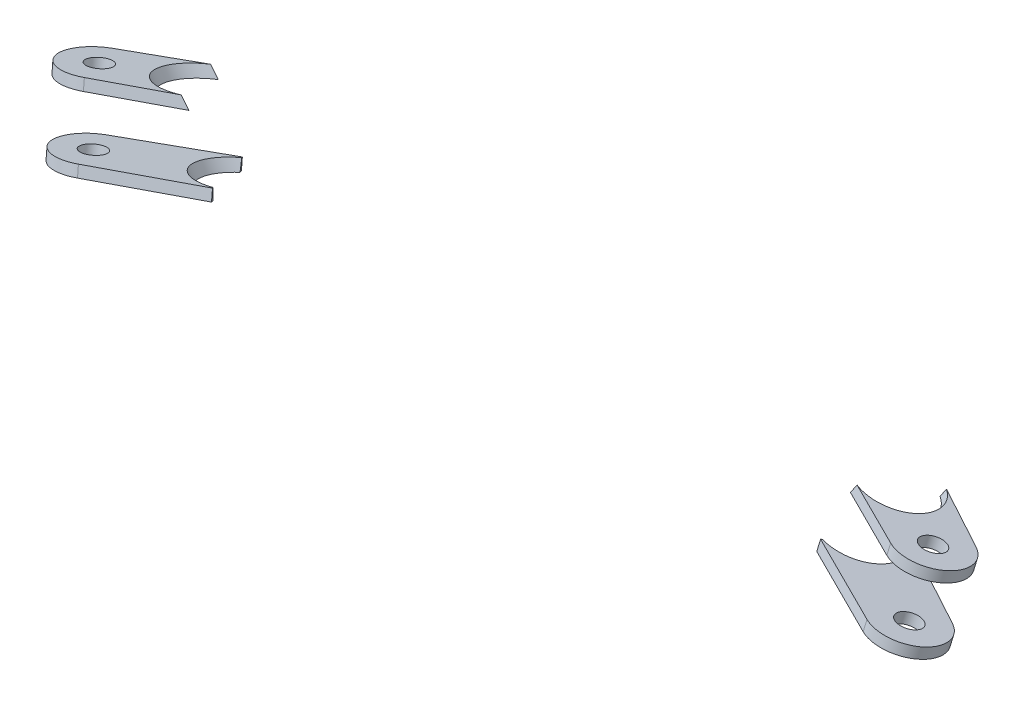
ISO-10303-21;
HEADER;
FILE_DESCRIPTION(('STEP AP214'),'2;1');
FILE_NAME('part.step','',(''),(''),'','','');
FILE_SCHEMA(('AUTOMOTIVE_DESIGN { 1 0 10303 214 1 1 1 1 }'));
ENDSEC;
DATA;
#1=APPLICATION_CONTEXT('core data for automotive mechanical design processes');
#2=APPLICATION_PROTOCOL_DEFINITION('international standard','automotive_design',2000,#1);
#3=PRODUCT_CONTEXT('',#1,'mechanical');
#4=PRODUCT('Part','Part','',(#3));
#5=PRODUCT_RELATED_PRODUCT_CATEGORY('part','',(#4));
#6=PRODUCT_DEFINITION_FORMATION('','',#4);
#7=PRODUCT_DEFINITION_CONTEXT('part definition',#1,'design');
#8=PRODUCT_DEFINITION('design','',#6,#7);
#9=PRODUCT_DEFINITION_SHAPE('','',#8);
#10=(LENGTH_UNIT() NAMED_UNIT(*) SI_UNIT(.MILLI.,.METRE.));
#11=(NAMED_UNIT(*) PLANE_ANGLE_UNIT() SI_UNIT($,.RADIAN.));
#12=(NAMED_UNIT(*) SI_UNIT($,.STERADIAN.) SOLID_ANGLE_UNIT());
#13=UNCERTAINTY_MEASURE_WITH_UNIT(LENGTH_MEASURE(1.E-05),#10,'distance_accuracy_value','');
#14=(GEOMETRIC_REPRESENTATION_CONTEXT(3) GLOBAL_UNCERTAINTY_ASSIGNED_CONTEXT((#13)) GLOBAL_UNIT_ASSIGNED_CONTEXT((#10,
#11,#12)) REPRESENTATION_CONTEXT('',''));
#15=CARTESIAN_POINT('',(0.,0.,0.));
#16=DIRECTION('',(0.,0.,1.));
#17=DIRECTION('',(1.,0.,0.));
#18=AXIS2_PLACEMENT_3D('',#15,#16,#17);
#19=CARTESIAN_POINT('',(-125.132028381921,152.673885786824,-744.648349422238));
#20=DIRECTION('',(0.453654215941863,0.26339489229841,0.851364189444965));
#21=DIRECTION('',(-0.882527927159571,0.,0.470259989562614));
#22=AXIS2_PLACEMENT_3D('',#19,#20,#21);
#23=PLANE('',#22);
#24=CARTESIAN_POINT('',(-816.236879343844,1295.64042753398,-729.999999999999));
#25=DIRECTION('',(-0.453654215941863,-0.26339489229841,-0.851364189444965));
#26=DIRECTION('',(-0.513355819149366,0.858138063925243,0.00805395481235083));
#27=AXIS2_PLACEMENT_3D('',#24,#25,#26);
#28=ELLIPSE('',#27,1342.546520207,12.7);
#29=CARTESIAN_POINT('',(-134.045192631762,152.542395292603,-739.85823901538));
#30=VERTEX_POINT('',#29);
#31=CARTESIAN_POINT('',(-131.479179662302,148.858828278426,-740.085932248414));
#32=VERTEX_POINT('',#31);
#33=EDGE_CURVE('E12',#30,#32,#28,.F.);
#34=ORIENTED_EDGE('',*,*,#33,.T.);
#35=DIRECTION('',(0.880779515732176,0.0129936048049018,-0.473348297663324));
#36=VECTOR('',#35,1.);
#37=CARTESIAN_POINT('',(-124.609430099155,148.960173517885,-743.777871267211));
#38=LINE('',#37,#36);
#39=CARTESIAN_POINT('',(-156.801248728356,148.485267185769,-726.477352494188));
#40=VERTEX_POINT('',#39);
#41=EDGE_CURVE('E50',#40,#32,#38,.T.);
#42=ORIENTED_EDGE('',*,*,#41,.F.);
#43=DIRECTION('',(0.135739813705361,-0.964600589334924,0.226098222084896));
#44=VECTOR('',#43,1.);
#45=CARTESIAN_POINT('',(-157.323847011121,152.198979454709,-727.347830649215));
#46=LINE('',#45,#44);
#47=CARTESIAN_POINT('',(-157.323847011121,152.198979454709,-727.347830649215));
#48=VERTEX_POINT('',#47);
#49=EDGE_CURVE('E98',#48,#40,#46,.T.);
#50=ORIENTED_EDGE('',*,*,#49,.F.);
#51=DIRECTION('',(0.880779515732176,0.0129936048049018,-0.473348297663324));
#52=VECTOR('',#51,1.);
#53=CARTESIAN_POINT('',(-125.132028381921,152.673885786824,-744.648349422238));
#54=LINE('',#53,#52);
#55=EDGE_CURVE('E89',#48,#30,#54,.T.);
#56=ORIENTED_EDGE('',*,*,#55,.T.);
#57=EDGE_LOOP('',(#34,#42,#50,#56));
#58=FACE_BOUND('',#57,.T.);
#59=ADVANCED_FACE('F46',(#58),#23,.F.);
#60=CARTESIAN_POINT('',(-151.879996419819,155.359718162289,-717.131460375875));
#61=DIRECTION('',(0.135739813705361,-0.964600589334924,0.226098222084896));
#62=DIRECTION('',(0.,-0.228210419162911,-0.973611834657677));
#63=AXIS2_PLACEMENT_3D('',#60,#61,#62);
#64=PLANE('',#63);
#65=CARTESIAN_POINT('',(-126.709862591882,155.885360954245,-730.));
#66=DIRECTION('',(-0.135739813705361,0.964600589334924,-0.226098222084896));
#67=DIRECTION('',(-0.890226251767514,-0.0185911213529017,0.455139089587793));
#68=AXIS2_PLACEMENT_3D('',#65,#66,#67);
#69=ELLIPSE('',#68,14.1807187851749,12.7);
#70=CARTESIAN_POINT('',(-123.123066836803,159.150043757302,-718.225276856768));
#71=VERTEX_POINT('',#70);
#72=EDGE_CURVE('E56',#71,#30,#69,.F.);
#73=ORIENTED_EDGE('',*,*,#72,.T.);
#74=ORIENTED_EDGE('',*,*,#55,.F.);
#75=CARTESIAN_POINT('',(-151.879996419819,155.359718162289,-717.131460375875));
#76=DIRECTION('',(0.135739813705361,-0.964600589334924,0.226098222084896));
#77=DIRECTION('',(0.,-0.228210419162911,-0.973611834657677));
#78=AXIS2_PLACEMENT_3D('',#75,#76,#77);
#79=CIRCLE('',#78,12.);
#80=CARTESIAN_POINT('',(-146.890429920738,158.51096978648,-706.682831788722));
#81=VERTEX_POINT('',#80);
#82=EDGE_CURVE('E100',#81,#48,#79,.T.);
#83=ORIENTED_EDGE('',*,*,#82,.F.);
#84=DIRECTION('',(-0.899270473540139,-0.0241802319566752,0.436724091162161));
#85=VECTOR('',#84,1.);
#86=CARTESIAN_POINT('',(-114.02278090561,159.394738797518,-722.644763784844));
#87=LINE('',#86,#85);
#88=EDGE_CURVE('E92',#71,#81,#87,.T.);
#89=ORIENTED_EDGE('',*,*,#88,.F.);
#90=EDGE_LOOP('',(#73,#74,#83,#89));
#91=FACE_BOUND('',#90,.T.);
#92=CARTESIAN_POINT('',(-151.879996419819,155.359718162289,-717.131460375875));
#93=DIRECTION('',(0.135739813705361,-0.964600589334924,0.226098222084896));
#94=DIRECTION('',(0.,0.228210419162911,0.973611834657677));
#95=AXIS2_PLACEMENT_3D('',#92,#93,#94);
#96=CIRCLE('',#95,4.19999999999998);
#97=CARTESIAN_POINT('',(-151.879996419819,156.318201922774,-713.042290670313));
#98=VERTEX_POINT('',#97);
#99=EDGE_CURVE('E122',#98,#98,#96,.T.);
#100=ORIENTED_EDGE('',*,*,#99,.T.);
#101=EDGE_LOOP('',(#100));
#102=FACE_BOUND('',#101,.T.);
#103=ADVANCED_FACE('F86',(#91,#102),#64,.F.);
#104=CARTESIAN_POINT('',(-151.357398137054,151.64600589335,-716.260982220849));
#105=DIRECTION('',(0.135739813705361,-0.964600589334924,0.226098222084896));
#106=DIRECTION('',(0.,-0.228210419162911,-0.973611834657677));
#107=AXIS2_PLACEMENT_3D('',#104,#105,#106);
#108=PLANE('',#107);
#109=DIRECTION('',(-0.899270473540139,-0.0241802319566752,0.436724091162161));
#110=VECTOR('',#109,1.);
#111=CARTESIAN_POINT('',(-113.500182622844,155.681026528579,-721.774285629817));
#112=LINE('',#111,#110);
#113=CARTESIAN_POINT('',(-120.51415471485,155.492429796992,-718.36800167249));
#114=VERTEX_POINT('',#113);
#115=CARTESIAN_POINT('',(-146.367831637972,154.79725751754,-705.812353633695));
#116=VERTEX_POINT('',#115);
#117=EDGE_CURVE('E118',#114,#116,#112,.T.);
#118=ORIENTED_EDGE('',*,*,#117,.T.);
#119=CARTESIAN_POINT('',(-151.357398137054,151.64600589335,-716.260982220849));
#120=DIRECTION('',(0.135739813705361,-0.964600589334924,0.226098222084896));
#121=DIRECTION('',(0.,-0.228210419162911,-0.973611834657677));
#122=AXIS2_PLACEMENT_3D('',#119,#120,#121);
#123=CIRCLE('',#122,12.);
#124=EDGE_CURVE('E110',#116,#40,#123,.T.);
#125=ORIENTED_EDGE('',*,*,#124,.T.);
#126=ORIENTED_EDGE('',*,*,#41,.T.);
#127=CARTESIAN_POINT('',(-124.484658396061,152.207205211619,-730.));
#128=DIRECTION('',(-0.135739813705361,0.964600589334924,-0.226098222084896));
#129=DIRECTION('',(-0.890226251767514,-0.0185911213529017,0.455139089587793));
#130=AXIS2_PLACEMENT_3D('',#127,#128,#129);
#131=ELLIPSE('',#130,14.1807187851749,12.7);
#132=EDGE_CURVE('E99',#114,#32,#131,.F.);
#133=ORIENTED_EDGE('',*,*,#132,.F.);
#134=EDGE_LOOP('',(#118,#125,#126,#133));
#135=FACE_BOUND('',#134,.T.);
#136=CARTESIAN_POINT('',(-151.357398137054,151.64600589335,-716.260982220849));
#137=DIRECTION('',(0.135739813705361,-0.964600589334924,0.226098222084896));
#138=DIRECTION('',(0.,0.228210419162911,0.973611834657677));
#139=AXIS2_PLACEMENT_3D('',#136,#137,#138);
#140=CIRCLE('',#139,4.19999999999998);
#141=CARTESIAN_POINT('',(-151.357398137054,152.604489653834,-712.171812515286));
#142=VERTEX_POINT('',#141);
#143=EDGE_CURVE('E106',#142,#142,#140,.T.);
#144=ORIENTED_EDGE('',*,*,#143,.F.);
#145=EDGE_LOOP('',(#144));
#146=FACE_BOUND('',#145,.T.);
#147=ADVANCED_FACE('F107',(#135,#146),#108,.T.);
#148=CARTESIAN_POINT('',(-114.02278090561,159.394738797518,-722.644763784844));
#149=DIRECTION('',(-0.415797208256775,-0.262604302015862,-0.870719048929466));
#150=DIRECTION('',(0.902389666748434,0.,-0.430920978075622));
#151=AXIS2_PLACEMENT_3D('',#148,#149,#150);
#152=PLANE('',#151);
#153=CARTESIAN_POINT('',(-816.236879448093,1295.6404277063,-729.999999999999));
#154=DIRECTION('',(0.415797208256775,0.262604302015862,0.870719048929466));
#155=DIRECTION('',(-0.521580880255224,0.853162080915203,-0.00823705290899768));
#156=AXIS2_PLACEMENT_3D('',#153,#154,#155);
#157=ELLIPSE('',#156,1342.54652040715,12.7);
#158=EDGE_CURVE('E63',#114,#71,#157,.F.);
#159=ORIENTED_EDGE('',*,*,#158,.T.);
#160=ORIENTED_EDGE('',*,*,#88,.T.);
#161=DIRECTION('',(0.135739813705361,-0.964600589334924,0.226098222084896));
#162=VECTOR('',#161,1.);
#163=CARTESIAN_POINT('',(-146.890429920738,158.51096978648,-706.682831788722));
#164=LINE('',#163,#162);
#165=EDGE_CURVE('E116',#81,#116,#164,.T.);
#166=ORIENTED_EDGE('',*,*,#165,.T.);
#167=ORIENTED_EDGE('',*,*,#117,.F.);
#168=EDGE_LOOP('',(#159,#160,#166,#167));
#169=FACE_BOUND('',#168,.T.);
#170=ADVANCED_FACE('F127',(#169),#152,.F.);
#171=CARTESIAN_POINT('',(-151.879996419819,155.359718162289,-717.131460375875));
#172=DIRECTION('',(0.135739813705361,-0.964600589334924,0.226098222084896));
#173=DIRECTION('',(0.,-0.228210419162911,-0.973611834657677));
#174=AXIS2_PLACEMENT_3D('',#171,#172,#173);
#175=CYLINDRICAL_SURFACE('',#174,12.);
#176=ORIENTED_EDGE('',*,*,#124,.F.);
#177=ORIENTED_EDGE('',*,*,#165,.F.);
#178=ORIENTED_EDGE('',*,*,#82,.T.);
#179=ORIENTED_EDGE('',*,*,#49,.T.);
#180=EDGE_LOOP('',(#176,#177,#178,#179));
#181=FACE_BOUND('',#180,.T.);
#182=ADVANCED_FACE('F128',(#181),#175,.T.);
#183=CARTESIAN_POINT('',(-151.879996419819,155.359718162289,-717.131460375875));
#184=DIRECTION('',(0.135739813705361,-0.964600589334924,0.226098222084896));
#185=DIRECTION('',(0.,-0.228210419162911,-0.973611834657677));
#186=AXIS2_PLACEMENT_3D('',#183,#184,#185);
#187=CYLINDRICAL_SURFACE('',#186,4.19999999999998);
#188=ORIENTED_EDGE('',*,*,#99,.F.);
#189=EDGE_LOOP('',(#188));
#190=FACE_BOUND('',#189,.T.);
#191=ORIENTED_EDGE('',*,*,#143,.T.);
#192=EDGE_LOOP('',(#191));
#193=FACE_BOUND('',#192,.T.);
#194=ADVANCED_FACE('F130',(#190,#193),#187,.F.);
#195=CARTESIAN_POINT('',(-105.,120.,-730.));
#196=DIRECTION('',(-0.517624253172971,0.855608048423531,0.));
#197=DIRECTION('',(-0.855608048423532,-0.517624253172971,0.));
#198=AXIS2_PLACEMENT_3D('',#195,#196,#197);
#199=CYLINDRICAL_SURFACE('',#198,12.7);
#200=ORIENTED_EDGE('',*,*,#158,.F.);
#201=ORIENTED_EDGE('',*,*,#132,.T.);
#202=ORIENTED_EDGE('',*,*,#33,.F.);
#203=ORIENTED_EDGE('',*,*,#72,.F.);
#204=EDGE_LOOP('',(#200,#201,#202,#203));
#205=FACE_BOUND('',#204,.T.);
#206=ADVANCED_FACE('F48',(#205),#199,.F.);
#207=CLOSED_SHELL('',(#59,#103,#147,#170,#182,#194,#206));
#208=MANIFOLD_SOLID_BREP('B2',#207);
#209=CARTESIAN_POINT('',(-121.372035542283,125.954449462247,-738.385428670486));
#210=DIRECTION('',(0.890226251766824,0.0185911213524841,-0.45513908958916));
#211=DIRECTION('',(0.455217764798812,0.,0.890380136015833));
#212=AXIS2_PLACEMENT_3D('',#209,#210,#211);
#213=PLANE('',#212);
#214=DIRECTION('',(0.434824014562703,0.263059068008641,0.861236322444658));
#215=VECTOR('',#214,1.);
#216=CARTESIAN_POINT('',(-121.894633825048,129.668161731186,-739.255906825513));
#217=LINE('',#216,#215);
#218=CARTESIAN_POINT('',(-111.023621300444,136.244887779559,-717.724182416604));
#219=VERTEX_POINT('',#218);
#220=CARTESIAN_POINT('',(-110.785386348737,136.38901474188,-717.25232118812));
#221=VERTEX_POINT('',#220);
#222=EDGE_CURVE('E263',#219,#221,#217,.T.);
#223=ORIENTED_EDGE('',*,*,#222,.T.);
#224=DIRECTION('',(-0.135739813705361,0.964600589334924,-0.226098222084896));
#225=VECTOR('',#224,1.);
#226=CARTESIAN_POINT('',(-110.262788065972,132.675302472941,-716.381843033093));
#227=LINE('',#226,#225);
#228=CARTESIAN_POINT('',(-110.262788065972,132.675302472941,-716.381843033093));
#229=VERTEX_POINT('',#228);
#230=EDGE_CURVE('E289',#229,#221,#227,.T.);
#231=ORIENTED_EDGE('',*,*,#230,.F.);
#232=DIRECTION('',(0.434824014562703,0.263059068008641,0.861236322444658));
#233=VECTOR('',#232,1.);
#234=CARTESIAN_POINT('',(-121.372035542283,125.954449462247,-738.385428670486));
#235=LINE('',#234,#233);
#236=CARTESIAN_POINT('',(-110.769227952913,132.368917360345,-717.384925685295));
#237=VERTEX_POINT('',#236);
#238=EDGE_CURVE('E290',#237,#229,#235,.T.);
#239=ORIENTED_EDGE('',*,*,#238,.F.);
#240=CARTESIAN_POINT('',(-117.388166225761,140.477044232369,-730.));
#241=DIRECTION('',(-0.890226251766824,-0.0185911213524841,0.45513908958916));
#242=DIRECTION('',(-0.135739813705704,0.964600589334717,-0.226098222085575));
#243=AXIS2_PLACEMENT_3D('',#240,#241,#242);
#244=ELLIPSE('',#243,28.5459981864058,12.7);
#245=EDGE_CURVE('E272',#219,#237,#244,.F.);
#246=ORIENTED_EDGE('',*,*,#245,.F.);
#247=EDGE_LOOP('',(#223,#231,#239,#246));
#248=FACE_BOUND('',#247,.T.);
#249=ADVANCED_FACE('F203',(#248),#213,.T.);
#250=CARTESIAN_POINT('',(-121.372035542283,125.954449462247,-738.385428670486));
#251=VERTEX_POINT('',#250);
#252=CARTESIAN_POINT('',(-120.865595655335,126.260834574846,-737.382346018272));
#253=VERTEX_POINT('',#252);
#254=EDGE_CURVE('E270',#251,#253,#235,.T.);
#255=ORIENTED_EDGE('',*,*,#254,.F.);
#256=DIRECTION('',(-0.135739813705361,0.964600589334924,-0.226098222084896));
#257=VECTOR('',#256,1.);
#258=CARTESIAN_POINT('',(-121.372035542283,125.954449462247,-738.385428670486));
#259=LINE('',#258,#257);
#260=CARTESIAN_POINT('',(-121.894633825048,129.668161731186,-739.255906825513));
#261=VERTEX_POINT('',#260);
#262=EDGE_CURVE('E274',#251,#261,#259,.T.);
#263=ORIENTED_EDGE('',*,*,#262,.T.);
#264=CARTESIAN_POINT('',(-121.656398873337,129.812288693509,-738.784045597021));
#265=VERTEX_POINT('',#264);
#266=EDGE_CURVE('E207',#261,#265,#217,.T.);
#267=ORIENTED_EDGE('',*,*,#266,.T.);
#268=EDGE_CURVE('E265',#253,#265,#244,.F.);
#269=ORIENTED_EDGE('',*,*,#268,.F.);
#270=EDGE_LOOP('',(#255,#263,#267,#269));
#271=FACE_BOUND('',#270,.T.);
#272=ADVANCED_FACE('F205',(#271),#213,.T.);
#273=CARTESIAN_POINT('',(-121.372035542283,125.954449462247,-738.385428670486));
#274=DIRECTION('',(-0.453654215941863,-0.26339489229841,-0.851364189444965));
#275=DIRECTION('',(0.882527927159571,0.,-0.470259989562614));
#276=AXIS2_PLACEMENT_3D('',#273,#274,#275);
#277=PLANE('',#276);
#278=DIRECTION('',(0.880779515732176,0.0129936048049018,-0.473348297663324));
#279=VECTOR('',#278,1.);
#280=CARTESIAN_POINT('',(-121.894633825048,129.668161731186,-739.255906825513));
#281=LINE('',#280,#279);
#282=CARTESIAN_POINT('',(-154.086452454249,129.193255399071,-721.95538805249));
#283=VERTEX_POINT('',#282);
#284=EDGE_CURVE('E275',#283,#261,#281,.T.);
#285=ORIENTED_EDGE('',*,*,#284,.T.);
#286=ORIENTED_EDGE('',*,*,#262,.F.);
#287=DIRECTION('',(0.880779515732176,0.0129936048049018,-0.473348297663324));
#288=VECTOR('',#287,1.);
#289=CARTESIAN_POINT('',(-121.372035542283,125.954449462247,-738.385428670486));
#290=LINE('',#289,#288);
#291=CARTESIAN_POINT('',(-153.563854171483,125.479543130131,-721.084909897463));
#292=VERTEX_POINT('',#291);
#293=EDGE_CURVE('E269',#292,#251,#290,.T.);
#294=ORIENTED_EDGE('',*,*,#293,.F.);
#295=DIRECTION('',(-0.135739813705361,0.964600589334924,-0.226098222084896));
#296=VECTOR('',#295,1.);
#297=CARTESIAN_POINT('',(-153.563854171483,125.479543130131,-721.084909897463));
#298=LINE('',#297,#296);
#299=EDGE_CURVE('E300',#292,#283,#298,.T.);
#300=ORIENTED_EDGE('',*,*,#299,.T.);
#301=EDGE_LOOP('',(#285,#286,#294,#300));
#302=FACE_BOUND('',#301,.T.);
#303=ADVANCED_FACE('F316',(#302),#277,.T.);
#304=CARTESIAN_POINT('',(-148.120003580181,128.640281837712,-710.868539624124));
#305=DIRECTION('',(-0.135739813705361,0.964600589334924,-0.226098222084896));
#306=DIRECTION('',(0.,0.228210419162911,0.973611834657677));
#307=AXIS2_PLACEMENT_3D('',#304,#305,#306);
#308=CYLINDRICAL_SURFACE('',#307,12.);
#309=CARTESIAN_POINT('',(-148.642601862946,132.353994106652,-711.739017779151));
#310=DIRECTION('',(0.135739813705361,-0.964600589334924,0.226098222084896));
#311=DIRECTION('',(0.,-0.228210419162911,-0.973611834657677));
#312=AXIS2_PLACEMENT_3D('',#309,#310,#311);
#313=CIRCLE('',#312,12.);
#314=CARTESIAN_POINT('',(-143.653035363865,135.505245730842,-701.290389191997));
#315=VERTEX_POINT('',#314);
#316=EDGE_CURVE('E278',#315,#283,#313,.T.);
#317=ORIENTED_EDGE('',*,*,#316,.T.);
#318=ORIENTED_EDGE('',*,*,#299,.F.);
#319=CARTESIAN_POINT('',(-148.120003580181,128.640281837712,-710.868539624124));
#320=DIRECTION('',(0.135739813705361,-0.964600589334924,0.226098222084896));
#321=DIRECTION('',(0.,-0.228210419162911,-0.973611834657677));
#322=AXIS2_PLACEMENT_3D('',#319,#320,#321);
#323=CIRCLE('',#322,12.);
#324=CARTESIAN_POINT('',(-143.130437081099,131.791533461902,-700.41991103697));
#325=VERTEX_POINT('',#324);
#326=EDGE_CURVE('E304',#325,#292,#323,.T.);
#327=ORIENTED_EDGE('',*,*,#326,.F.);
#328=DIRECTION('',(-0.135739813705361,0.964600589334924,-0.226098222084896));
#329=VECTOR('',#328,1.);
#330=CARTESIAN_POINT('',(-143.130437081099,131.791533461902,-700.41991103697));
#331=LINE('',#330,#329);
#332=EDGE_CURVE('E287',#325,#315,#331,.T.);
#333=ORIENTED_EDGE('',*,*,#332,.T.);
#334=EDGE_LOOP('',(#317,#318,#327,#333));
#335=FACE_BOUND('',#334,.T.);
#336=ADVANCED_FACE('F313',(#335),#308,.T.);
#337=CARTESIAN_POINT('',(-110.262788065972,132.675302472941,-716.381843033093));
#338=DIRECTION('',(0.415797208256775,0.262604302015862,0.870719048929466));
#339=DIRECTION('',(-0.902389666748434,0.,0.430920978075622));
#340=AXIS2_PLACEMENT_3D('',#337,#338,#339);
#341=PLANE('',#340);
#342=DIRECTION('',(-0.899270473540139,-0.0241802319566752,0.436724091162161));
#343=VECTOR('',#342,1.);
#344=CARTESIAN_POINT('',(-110.785386348737,136.38901474188,-717.25232118812));
#345=LINE('',#344,#343);
#346=EDGE_CURVE('E280',#221,#315,#345,.T.);
#347=ORIENTED_EDGE('',*,*,#346,.T.);
#348=ORIENTED_EDGE('',*,*,#332,.F.);
#349=DIRECTION('',(-0.899270473540139,-0.0241802319566752,0.436724091162161));
#350=VECTOR('',#349,1.);
#351=CARTESIAN_POINT('',(-110.262788065972,132.675302472941,-716.381843033093));
#352=LINE('',#351,#350);
#353=EDGE_CURVE('E298',#229,#325,#352,.T.);
#354=ORIENTED_EDGE('',*,*,#353,.F.);
#355=ORIENTED_EDGE('',*,*,#230,.T.);
#356=EDGE_LOOP('',(#347,#348,#354,#355));
#357=FACE_BOUND('',#356,.T.);
#358=ADVANCED_FACE('F295',(#357),#341,.T.);
#359=CARTESIAN_POINT('',(-148.120003580181,128.640281837712,-710.868539624124));
#360=DIRECTION('',(0.135739813705361,-0.964600589334924,0.226098222084896));
#361=DIRECTION('',(0.,-0.228210419162911,-0.973611834657677));
#362=AXIS2_PLACEMENT_3D('',#359,#360,#361);
#363=PLANE('',#362);
#364=CARTESIAN_POINT('',(-148.120003580181,128.640281837712,-710.868539624124));
#365=DIRECTION('',(0.135739813705361,-0.964600589334924,0.226098222084896));
#366=DIRECTION('',(0.,0.228210419162911,0.973611834657677));
#367=AXIS2_PLACEMENT_3D('',#364,#365,#366);
#368=CIRCLE('',#367,4.19999999999998);
#369=CARTESIAN_POINT('',(-148.120003580181,129.598765598196,-706.779369918562));
#370=VERTEX_POINT('',#369);
#371=EDGE_CURVE('E284',#370,#370,#368,.T.);
#372=ORIENTED_EDGE('',*,*,#371,.F.);
#373=EDGE_LOOP('',(#372));
#374=FACE_BOUND('',#373,.T.);
#375=ORIENTED_EDGE('',*,*,#238,.T.);
#376=ORIENTED_EDGE('',*,*,#353,.T.);
#377=ORIENTED_EDGE('',*,*,#326,.T.);
#378=ORIENTED_EDGE('',*,*,#293,.T.);
#379=ORIENTED_EDGE('',*,*,#254,.T.);
#380=CARTESIAN_POINT('',(-110.699951884283,129.421746909896,-730.));
#381=DIRECTION('',(-0.135739813705361,0.964600589334924,-0.226098222084896));
#382=DIRECTION('',(-0.890226251767514,-0.0185911213529017,0.455139089587793));
#383=AXIS2_PLACEMENT_3D('',#380,#381,#382);
#384=ELLIPSE('',#383,14.1807187851749,12.7);
#385=EDGE_CURVE('E222',#237,#253,#384,.F.);
#386=ORIENTED_EDGE('',*,*,#385,.F.);
#387=EDGE_LOOP('',(#375,#376,#377,#378,#379,#386));
#388=FACE_BOUND('',#387,.T.);
#389=ADVANCED_FACE('F317',(#374,#388),#363,.T.);
#390=CARTESIAN_POINT('',(-148.642601862946,132.353994106652,-711.739017779151));
#391=DIRECTION('',(0.135739813705361,-0.964600589334924,0.226098222084896));
#392=DIRECTION('',(0.,-0.228210419162911,-0.973611834657677));
#393=AXIS2_PLACEMENT_3D('',#390,#391,#392);
#394=PLANE('',#393);
#395=CARTESIAN_POINT('',(-112.925156080105,133.099902652522,-730.));
#396=DIRECTION('',(-0.135739813705361,0.964600589334924,-0.226098222084896));
#397=DIRECTION('',(-0.890226251767514,-0.0185911213529017,0.455139089587793));
#398=AXIS2_PLACEMENT_3D('',#395,#396,#397);
#399=ELLIPSE('',#398,14.1807187851749,12.7);
#400=EDGE_CURVE('E44',#219,#265,#399,.F.);
#401=ORIENTED_EDGE('',*,*,#400,.T.);
#402=ORIENTED_EDGE('',*,*,#266,.F.);
#403=ORIENTED_EDGE('',*,*,#284,.F.);
#404=ORIENTED_EDGE('',*,*,#316,.F.);
#405=ORIENTED_EDGE('',*,*,#346,.F.);
#406=ORIENTED_EDGE('',*,*,#222,.F.);
#407=EDGE_LOOP('',(#401,#402,#403,#404,#405,#406));
#408=FACE_BOUND('',#407,.T.);
#409=CARTESIAN_POINT('',(-148.642601862946,132.353994106652,-711.739017779151));
#410=DIRECTION('',(0.135739813705361,-0.964600589334924,0.226098222084896));
#411=DIRECTION('',(0.,0.228210419162911,0.973611834657677));
#412=AXIS2_PLACEMENT_3D('',#409,#410,#411);
#413=CIRCLE('',#412,4.19999999999998);
#414=CARTESIAN_POINT('',(-148.642601862946,133.312477867136,-707.649848073589));
#415=VERTEX_POINT('',#414);
#416=EDGE_CURVE('E213',#415,#415,#413,.T.);
#417=ORIENTED_EDGE('',*,*,#416,.T.);
#418=EDGE_LOOP('',(#417));
#419=FACE_BOUND('',#418,.T.);
#420=ADVANCED_FACE('F257',(#408,#419),#394,.F.);
#421=CARTESIAN_POINT('',(-148.120003580181,128.640281837712,-710.868539624124));
#422=DIRECTION('',(-0.135739813705361,0.964600589334924,-0.226098222084896));
#423=DIRECTION('',(0.,0.228210419162911,0.973611834657677));
#424=AXIS2_PLACEMENT_3D('',#421,#422,#423);
#425=CYLINDRICAL_SURFACE('',#424,4.19999999999998);
#426=ORIENTED_EDGE('',*,*,#371,.T.);
#427=EDGE_LOOP('',(#426));
#428=FACE_BOUND('',#427,.T.);
#429=ORIENTED_EDGE('',*,*,#416,.F.);
#430=EDGE_LOOP('',(#429));
#431=FACE_BOUND('',#430,.T.);
#432=ADVANCED_FACE('F325',(#428,#431),#425,.F.);
#433=CARTESIAN_POINT('',(-105.,120.,-730.));
#434=DIRECTION('',(-0.517624253172971,0.855608048423531,0.));
#435=DIRECTION('',(-0.855608048423532,-0.517624253172971,0.));
#436=AXIS2_PLACEMENT_3D('',#433,#434,#435);
#437=CYLINDRICAL_SURFACE('',#436,12.7);
#438=ORIENTED_EDGE('',*,*,#245,.T.);
#439=ORIENTED_EDGE('',*,*,#385,.T.);
#440=ORIENTED_EDGE('',*,*,#268,.T.);
#441=ORIENTED_EDGE('',*,*,#400,.F.);
#442=EDGE_LOOP('',(#438,#439,#440,#441));
#443=FACE_BOUND('',#442,.T.);
#444=ADVANCED_FACE('F266',(#443),#437,.F.);
#445=CLOSED_SHELL('',(#249,#272,#303,#336,#358,#389,#420,#432,#444));
#446=MANIFOLD_SOLID_BREP('B6',#445);
#447=CARTESIAN_POINT('',(121.372035542283,125.954449462247,-738.385428670486));
#448=DIRECTION('',(-0.890226251766824,0.0185911213524841,-0.45513908958916));
#449=DIRECTION('',(-0.455217764798812,0.,0.890380136015833));
#450=AXIS2_PLACEMENT_3D('',#447,#448,#449);
#451=PLANE('',#450);
#452=DIRECTION('',(-0.434824014562703,0.263059068008641,0.861236322444658));
#453=VECTOR('',#452,1.);
#454=CARTESIAN_POINT('',(121.894633825048,129.668161731186,-739.255906825513));
#455=LINE('',#454,#453);
#456=CARTESIAN_POINT('',(111.023621300444,136.244887779559,-717.724182416604));
#457=VERTEX_POINT('',#456);
#458=CARTESIAN_POINT('',(110.785386348737,136.38901474188,-717.25232118812));
#459=VERTEX_POINT('',#458);
#460=EDGE_CURVE('E475',#457,#459,#455,.T.);
#461=ORIENTED_EDGE('',*,*,#460,.F.);
#462=CARTESIAN_POINT('',(117.388166225761,140.477044232369,-730.));
#463=DIRECTION('',(-0.890226251766824,0.0185911213524841,-0.45513908958916));
#464=DIRECTION('',(0.135739813705704,0.964600589334717,-0.226098222085575));
#465=AXIS2_PLACEMENT_3D('',#462,#463,#464);
#466=ELLIPSE('',#465,28.5459981864058,12.7);
#467=CARTESIAN_POINT('',(110.769227952913,132.368917360345,-717.384925685295));
#468=VERTEX_POINT('',#467);
#469=EDGE_CURVE('E454',#457,#468,#466,.F.);
#470=ORIENTED_EDGE('',*,*,#469,.T.);
#471=DIRECTION('',(-0.434824014562703,0.263059068008641,0.861236322444658));
#472=VECTOR('',#471,1.);
#473=CARTESIAN_POINT('',(121.372035542283,125.954449462247,-738.385428670486));
#474=LINE('',#473,#472);
#475=CARTESIAN_POINT('',(110.262788065972,132.675302472941,-716.381843033093));
#476=VERTEX_POINT('',#475);
#477=EDGE_CURVE('E492',#468,#476,#474,.T.);
#478=ORIENTED_EDGE('',*,*,#477,.T.);
#479=DIRECTION('',(0.135739813705361,0.964600589334924,-0.226098222084896));
#480=VECTOR('',#479,1.);
#481=CARTESIAN_POINT('',(110.262788065972,132.675302472941,-716.381843033093));
#482=LINE('',#481,#480);
#483=EDGE_CURVE('E491',#476,#459,#482,.T.);
#484=ORIENTED_EDGE('',*,*,#483,.T.);
#485=EDGE_LOOP('',(#461,#470,#478,#484));
#486=FACE_BOUND('',#485,.T.);
#487=ADVANCED_FACE('F407',(#486),#451,.T.);
#488=CARTESIAN_POINT('',(121.372035542283,125.954449462247,-738.385428670486));
#489=VERTEX_POINT('',#488);
#490=CARTESIAN_POINT('',(120.865595655335,126.260834574846,-737.382346018272));
#491=VERTEX_POINT('',#490);
#492=EDGE_CURVE('E467',#489,#491,#474,.T.);
#493=ORIENTED_EDGE('',*,*,#492,.T.);
#494=CARTESIAN_POINT('',(121.656398873337,129.812288693509,-738.784045597021));
#495=VERTEX_POINT('',#494);
#496=EDGE_CURVE('E458',#491,#495,#466,.F.);
#497=ORIENTED_EDGE('',*,*,#496,.T.);
#498=CARTESIAN_POINT('',(121.894633825048,129.668161731186,-739.255906825513));
#499=VERTEX_POINT('',#498);
#500=EDGE_CURVE('E411',#499,#495,#455,.T.);
#501=ORIENTED_EDGE('',*,*,#500,.F.);
#502=DIRECTION('',(0.135739813705361,0.964600589334924,-0.226098222084896));
#503=VECTOR('',#502,1.);
#504=CARTESIAN_POINT('',(121.372035542283,125.954449462247,-738.385428670486));
#505=LINE('',#504,#503);
#506=EDGE_CURVE('E511',#489,#499,#505,.T.);
#507=ORIENTED_EDGE('',*,*,#506,.F.);
#508=EDGE_LOOP('',(#493,#497,#501,#507));
#509=FACE_BOUND('',#508,.T.);
#510=ADVANCED_FACE('F409',(#509),#451,.T.);
#511=CARTESIAN_POINT('',(121.372035542283,125.954449462247,-738.385428670486));
#512=DIRECTION('',(0.453654215941863,-0.26339489229841,-0.851364189444965));
#513=DIRECTION('',(-0.882527927159571,0.,-0.470259989562614));
#514=AXIS2_PLACEMENT_3D('',#511,#512,#513);
#515=PLANE('',#514);
#516=DIRECTION('',(-0.880779515732176,0.0129936048049018,-0.473348297663324));
#517=VECTOR('',#516,1.);
#518=CARTESIAN_POINT('',(121.894633825048,129.668161731186,-739.255906825513));
#519=LINE('',#518,#517);
#520=CARTESIAN_POINT('',(154.086452454249,129.193255399071,-721.95538805249));
#521=VERTEX_POINT('',#520);
#522=EDGE_CURVE('E474',#521,#499,#519,.T.);
#523=ORIENTED_EDGE('',*,*,#522,.F.);
#524=DIRECTION('',(0.135739813705361,0.964600589334924,-0.226098222084896));
#525=VECTOR('',#524,1.);
#526=CARTESIAN_POINT('',(153.563854171483,125.479543130131,-721.084909897463));
#527=LINE('',#526,#525);
#528=CARTESIAN_POINT('',(153.563854171483,125.479543130131,-721.084909897463));
#529=VERTEX_POINT('',#528);
#530=EDGE_CURVE('E505',#529,#521,#527,.T.);
#531=ORIENTED_EDGE('',*,*,#530,.F.);
#532=DIRECTION('',(-0.880779515732176,0.0129936048049018,-0.473348297663324));
#533=VECTOR('',#532,1.);
#534=CARTESIAN_POINT('',(121.372035542283,125.954449462247,-738.385428670486));
#535=LINE('',#534,#533);
#536=EDGE_CURVE('E468',#529,#489,#535,.T.);
#537=ORIENTED_EDGE('',*,*,#536,.T.);
#538=ORIENTED_EDGE('',*,*,#506,.T.);
#539=EDGE_LOOP('',(#523,#531,#537,#538));
#540=FACE_BOUND('',#539,.T.);
#541=ADVANCED_FACE('F516',(#540),#515,.T.);
#542=CARTESIAN_POINT('',(148.120003580181,128.640281837712,-710.868539624124));
#543=DIRECTION('',(0.135739813705361,0.964600589334924,-0.226098222084896));
#544=DIRECTION('',(0.,0.228210419162911,0.973611834657677));
#545=AXIS2_PLACEMENT_3D('',#542,#543,#544);
#546=CYLINDRICAL_SURFACE('',#545,12.);
#547=CARTESIAN_POINT('',(148.642601862946,132.353994106652,-711.739017779151));
#548=DIRECTION('',(0.135739813705361,0.964600589334924,-0.226098222084896));
#549=DIRECTION('',(0.,-0.228210419162911,-0.973611834657677));
#550=AXIS2_PLACEMENT_3D('',#547,#548,#549);
#551=CIRCLE('',#550,12.);
#552=CARTESIAN_POINT('',(143.653035363865,135.505245730842,-701.290389191997));
#553=VERTEX_POINT('',#552);
#554=EDGE_CURVE('E478',#553,#521,#551,.T.);
#555=ORIENTED_EDGE('',*,*,#554,.F.);
#556=DIRECTION('',(0.135739813705361,0.964600589334924,-0.226098222084896));
#557=VECTOR('',#556,1.);
#558=CARTESIAN_POINT('',(143.130437081099,131.791533461902,-700.41991103697));
#559=LINE('',#558,#557);
#560=CARTESIAN_POINT('',(143.130437081099,131.791533461902,-700.41991103697));
#561=VERTEX_POINT('',#560);
#562=EDGE_CURVE('E489',#561,#553,#559,.T.);
#563=ORIENTED_EDGE('',*,*,#562,.F.);
#564=CARTESIAN_POINT('',(148.120003580181,128.640281837712,-710.868539624124));
#565=DIRECTION('',(0.135739813705361,0.964600589334924,-0.226098222084896));
#566=DIRECTION('',(0.,-0.228210419162911,-0.973611834657677));
#567=AXIS2_PLACEMENT_3D('',#564,#565,#566);
#568=CIRCLE('',#567,12.);
#569=EDGE_CURVE('E503',#561,#529,#568,.T.);
#570=ORIENTED_EDGE('',*,*,#569,.T.);
#571=ORIENTED_EDGE('',*,*,#530,.T.);
#572=EDGE_LOOP('',(#555,#563,#570,#571));
#573=FACE_BOUND('',#572,.T.);
#574=ADVANCED_FACE('F519',(#573),#546,.T.);
#575=CARTESIAN_POINT('',(110.262788065972,132.675302472941,-716.381843033093));
#576=DIRECTION('',(-0.415797208256775,0.262604302015862,0.870719048929466));
#577=DIRECTION('',(0.902389666748434,0.,0.430920978075622));
#578=AXIS2_PLACEMENT_3D('',#575,#576,#577);
#579=PLANE('',#578);
#580=DIRECTION('',(0.899270473540139,-0.0241802319566752,0.436724091162161));
#581=VECTOR('',#580,1.);
#582=CARTESIAN_POINT('',(110.785386348737,136.38901474188,-717.25232118812));
#583=LINE('',#582,#581);
#584=EDGE_CURVE('E480',#459,#553,#583,.T.);
#585=ORIENTED_EDGE('',*,*,#584,.F.);
#586=ORIENTED_EDGE('',*,*,#483,.F.);
#587=DIRECTION('',(0.899270473540139,-0.0241802319566752,0.436724091162161));
#588=VECTOR('',#587,1.);
#589=CARTESIAN_POINT('',(110.262788065972,132.675302472941,-716.381843033093));
#590=LINE('',#589,#588);
#591=EDGE_CURVE('E500',#476,#561,#590,.T.);
#592=ORIENTED_EDGE('',*,*,#591,.T.);
#593=ORIENTED_EDGE('',*,*,#562,.T.);
#594=EDGE_LOOP('',(#585,#586,#592,#593));
#595=FACE_BOUND('',#594,.T.);
#596=ADVANCED_FACE('F521',(#595),#579,.T.);
#597=CARTESIAN_POINT('',(148.120003580181,128.640281837712,-710.868539624124));
#598=DIRECTION('',(-0.135739813705361,-0.964600589334924,0.226098222084896));
#599=DIRECTION('',(0.,-0.228210419162911,-0.973611834657677));
#600=AXIS2_PLACEMENT_3D('',#597,#598,#599);
#601=PLANE('',#600);
#602=CARTESIAN_POINT('',(148.120003580181,128.640281837712,-710.868539624124));
#603=DIRECTION('',(0.135739813705361,0.964600589334924,-0.226098222084896));
#604=DIRECTION('',(0.,0.228210419162911,0.973611834657677));
#605=AXIS2_PLACEMENT_3D('',#602,#603,#604);
#606=CIRCLE('',#605,4.19999999999998);
#607=CARTESIAN_POINT('',(148.120003580181,129.598765598196,-706.779369918562));
#608=VERTEX_POINT('',#607);
#609=EDGE_CURVE('E484',#608,#608,#606,.T.);
#610=ORIENTED_EDGE('',*,*,#609,.T.);
#611=EDGE_LOOP('',(#610));
#612=FACE_BOUND('',#611,.T.);
#613=ORIENTED_EDGE('',*,*,#477,.F.);
#614=CARTESIAN_POINT('',(110.699951884283,129.421746909896,-730.));
#615=DIRECTION('',(-0.135739813705361,-0.964600589334924,0.226098222084896));
#616=DIRECTION('',(0.890226251767514,-0.0185911213529017,0.455139089587793));
#617=AXIS2_PLACEMENT_3D('',#614,#615,#616);
#618=ELLIPSE('',#617,14.1807187851749,12.7);
#619=EDGE_CURVE('E426',#468,#491,#618,.F.);
#620=ORIENTED_EDGE('',*,*,#619,.T.);
#621=ORIENTED_EDGE('',*,*,#492,.F.);
#622=ORIENTED_EDGE('',*,*,#536,.F.);
#623=ORIENTED_EDGE('',*,*,#569,.F.);
#624=ORIENTED_EDGE('',*,*,#591,.F.);
#625=EDGE_LOOP('',(#613,#620,#621,#622,#623,#624));
#626=FACE_BOUND('',#625,.T.);
#627=ADVANCED_FACE('F497',(#612,#626),#601,.T.);
#628=CARTESIAN_POINT('',(148.642601862946,132.353994106652,-711.739017779151));
#629=DIRECTION('',(-0.135739813705361,-0.964600589334924,0.226098222084896));
#630=DIRECTION('',(0.,-0.228210419162911,-0.973611834657677));
#631=AXIS2_PLACEMENT_3D('',#628,#629,#630);
#632=PLANE('',#631);
#633=CARTESIAN_POINT('',(112.925156080105,133.099902652522,-730.));
#634=DIRECTION('',(-0.135739813705361,-0.964600589334924,0.226098222084896));
#635=DIRECTION('',(0.890226251767514,-0.0185911213529017,0.455139089587793));
#636=AXIS2_PLACEMENT_3D('',#633,#634,#635);
#637=ELLIPSE('',#636,14.1807187851749,12.7);
#638=EDGE_CURVE('E201',#457,#495,#637,.F.);
#639=ORIENTED_EDGE('',*,*,#638,.F.);
#640=ORIENTED_EDGE('',*,*,#460,.T.);
#641=ORIENTED_EDGE('',*,*,#584,.T.);
#642=ORIENTED_EDGE('',*,*,#554,.T.);
#643=ORIENTED_EDGE('',*,*,#522,.T.);
#644=ORIENTED_EDGE('',*,*,#500,.T.);
#645=EDGE_LOOP('',(#639,#640,#641,#642,#643,#644));
#646=FACE_BOUND('',#645,.T.);
#647=CARTESIAN_POINT('',(148.642601862946,132.353994106652,-711.739017779151));
#648=DIRECTION('',(0.135739813705361,0.964600589334924,-0.226098222084896));
#649=DIRECTION('',(0.,0.228210419162911,0.973611834657677));
#650=AXIS2_PLACEMENT_3D('',#647,#648,#649);
#651=CIRCLE('',#650,4.19999999999998);
#652=CARTESIAN_POINT('',(148.642601862946,133.312477867136,-707.649848073589));
#653=VERTEX_POINT('',#652);
#654=EDGE_CURVE('E417',#653,#653,#651,.T.);
#655=ORIENTED_EDGE('',*,*,#654,.F.);
#656=EDGE_LOOP('',(#655));
#657=FACE_BOUND('',#656,.T.);
#658=ADVANCED_FACE('F470',(#646,#657),#632,.F.);
#659=CARTESIAN_POINT('',(148.120003580181,128.640281837712,-710.868539624124));
#660=DIRECTION('',(0.135739813705361,0.964600589334924,-0.226098222084896));
#661=DIRECTION('',(0.,0.228210419162911,0.973611834657677));
#662=AXIS2_PLACEMENT_3D('',#659,#660,#661);
#663=CYLINDRICAL_SURFACE('',#662,4.19999999999998);
#664=ORIENTED_EDGE('',*,*,#609,.F.);
#665=EDGE_LOOP('',(#664));
#666=FACE_BOUND('',#665,.T.);
#667=ORIENTED_EDGE('',*,*,#654,.T.);
#668=EDGE_LOOP('',(#667));
#669=FACE_BOUND('',#668,.T.);
#670=ADVANCED_FACE('F542',(#666,#669),#663,.F.);
#671=CARTESIAN_POINT('',(105.,120.,-730.));
#672=DIRECTION('',(0.517624253172971,0.855608048423531,0.));
#673=DIRECTION('',(0.855608048423532,-0.517624253172971,0.));
#674=AXIS2_PLACEMENT_3D('',#671,#672,#673);
#675=CYLINDRICAL_SURFACE('',#674,12.7);
#676=ORIENTED_EDGE('',*,*,#469,.F.);
#677=ORIENTED_EDGE('',*,*,#638,.T.);
#678=ORIENTED_EDGE('',*,*,#496,.F.);
#679=ORIENTED_EDGE('',*,*,#619,.F.);
#680=EDGE_LOOP('',(#676,#677,#678,#679));
#681=FACE_BOUND('',#680,.T.);
#682=ADVANCED_FACE('F457',(#681),#675,.F.);
#683=CLOSED_SHELL('',(#487,#510,#541,#574,#596,#627,#658,#670,#682));
#684=MANIFOLD_SOLID_BREP('B38',#683);
#685=CARTESIAN_POINT('',(125.132028381921,152.673885786824,-744.648349422238));
#686=DIRECTION('',(-0.453654215941863,0.26339489229841,0.851364189444965));
#687=DIRECTION('',(0.882527927159571,0.,0.470259989562614));
#688=AXIS2_PLACEMENT_3D('',#685,#686,#687);
#689=PLANE('',#688);
#690=CARTESIAN_POINT('',(816.236879343844,1295.64042753398,-729.999999999999));
#691=DIRECTION('',(-0.453654215941863,0.26339489229841,0.851364189444965));
#692=DIRECTION('',(0.513355819149366,0.858138063925243,0.00805395481235083));
#693=AXIS2_PLACEMENT_3D('',#690,#691,#692);
#694=ELLIPSE('',#693,1342.546520207,12.7);
#695=CARTESIAN_POINT('',(134.045192631762,152.542395292603,-739.85823901538));
#696=VERTEX_POINT('',#695);
#697=CARTESIAN_POINT('',(131.479179662302,148.858828278426,-740.085932248414));
#698=VERTEX_POINT('',#697);
#699=EDGE_CURVE('E405',#696,#698,#694,.F.);
#700=ORIENTED_EDGE('',*,*,#699,.F.);
#701=DIRECTION('',(-0.880779515732176,0.0129936048049018,-0.473348297663324));
#702=VECTOR('',#701,1.);
#703=CARTESIAN_POINT('',(125.132028381921,152.673885786824,-744.648349422238));
#704=LINE('',#703,#702);
#705=CARTESIAN_POINT('',(157.323847011121,152.198979454709,-727.347830649215));
#706=VERTEX_POINT('',#705);
#707=EDGE_CURVE('E648',#706,#696,#704,.T.);
#708=ORIENTED_EDGE('',*,*,#707,.F.);
#709=DIRECTION('',(-0.135739813705361,-0.964600589334924,0.226098222084896));
#710=VECTOR('',#709,1.);
#711=CARTESIAN_POINT('',(157.323847011121,152.198979454709,-727.347830649215));
#712=LINE('',#711,#710);
#713=CARTESIAN_POINT('',(156.801248728356,148.485267185769,-726.477352494188));
#714=VERTEX_POINT('',#713);
#715=EDGE_CURVE('E672',#706,#714,#712,.T.);
#716=ORIENTED_EDGE('',*,*,#715,.T.);
#717=DIRECTION('',(-0.880779515732176,0.0129936048049018,-0.473348297663324));
#718=VECTOR('',#717,1.);
#719=CARTESIAN_POINT('',(124.609430099155,148.960173517885,-743.777871267211));
#720=LINE('',#719,#718);
#721=EDGE_CURVE('E606',#714,#698,#720,.T.);
#722=ORIENTED_EDGE('',*,*,#721,.T.);
#723=EDGE_LOOP('',(#700,#708,#716,#722));
#724=FACE_BOUND('',#723,.T.);
#725=ADVANCED_FACE('F602',(#724),#689,.F.);
#726=CARTESIAN_POINT('',(151.879996419819,155.359718162289,-717.131460375875));
#727=DIRECTION('',(-0.135739813705361,-0.964600589334924,0.226098222084896));
#728=DIRECTION('',(0.,-0.228210419162911,-0.973611834657677));
#729=AXIS2_PLACEMENT_3D('',#726,#727,#728);
#730=PLANE('',#729);
#731=CARTESIAN_POINT('',(126.709862591882,155.885360954245,-730.));
#732=DIRECTION('',(-0.135739813705361,-0.964600589334924,0.226098222084896));
#733=DIRECTION('',(0.890226251767514,-0.0185911213529017,0.455139089587793));
#734=AXIS2_PLACEMENT_3D('',#731,#732,#733);
#735=ELLIPSE('',#734,14.1807187851749,12.7);
#736=CARTESIAN_POINT('',(123.123066836803,159.150043757302,-718.225276856768));
#737=VERTEX_POINT('',#736);
#738=EDGE_CURVE('E612',#737,#696,#735,.F.);
#739=ORIENTED_EDGE('',*,*,#738,.F.);
#740=DIRECTION('',(0.899270473540139,-0.0241802319566752,0.436724091162161));
#741=VECTOR('',#740,1.);
#742=CARTESIAN_POINT('',(114.02278090561,159.394738797518,-722.644763784844));
#743=LINE('',#742,#741);
#744=CARTESIAN_POINT('',(146.890429920738,158.51096978648,-706.682831788722));
#745=VERTEX_POINT('',#744);
#746=EDGE_CURVE('E657',#737,#745,#743,.T.);
#747=ORIENTED_EDGE('',*,*,#746,.T.);
#748=CARTESIAN_POINT('',(151.879996419819,155.359718162289,-717.131460375875));
#749=DIRECTION('',(0.135739813705361,0.964600589334924,-0.226098222084896));
#750=DIRECTION('',(0.,-0.228210419162911,-0.973611834657677));
#751=AXIS2_PLACEMENT_3D('',#748,#749,#750);
#752=CIRCLE('',#751,12.);
#753=EDGE_CURVE('E653',#745,#706,#752,.T.);
#754=ORIENTED_EDGE('',*,*,#753,.T.);
#755=ORIENTED_EDGE('',*,*,#707,.T.);
#756=EDGE_LOOP('',(#739,#747,#754,#755));
#757=FACE_BOUND('',#756,.T.);
#758=CARTESIAN_POINT('',(151.879996419819,155.359718162289,-717.131460375875));
#759=DIRECTION('',(0.135739813705361,0.964600589334924,-0.226098222084896));
#760=DIRECTION('',(0.,0.228210419162911,0.973611834657677));
#761=AXIS2_PLACEMENT_3D('',#758,#759,#760);
#762=CIRCLE('',#761,4.19999999999998);
#763=CARTESIAN_POINT('',(151.879996419819,156.318201922774,-713.042290670313));
#764=VERTEX_POINT('',#763);
#765=EDGE_CURVE('E665',#764,#764,#762,.T.);
#766=ORIENTED_EDGE('',*,*,#765,.F.);
#767=EDGE_LOOP('',(#766));
#768=FACE_BOUND('',#767,.T.);
#769=ADVANCED_FACE('F650',(#757,#768),#730,.F.);
#770=CARTESIAN_POINT('',(151.357398137054,151.64600589335,-716.260982220849));
#771=DIRECTION('',(-0.135739813705361,-0.964600589334924,0.226098222084896));
#772=DIRECTION('',(0.,-0.228210419162911,-0.973611834657677));
#773=AXIS2_PLACEMENT_3D('',#770,#771,#772);
#774=PLANE('',#773);
#775=DIRECTION('',(0.899270473540139,-0.0241802319566752,0.436724091162161));
#776=VECTOR('',#775,1.);
#777=CARTESIAN_POINT('',(113.500182622844,155.681026528579,-721.774285629817));
#778=LINE('',#777,#776);
#779=CARTESIAN_POINT('',(120.51415471485,155.492429796992,-718.36800167249));
#780=VERTEX_POINT('',#779);
#781=CARTESIAN_POINT('',(146.367831637972,154.79725751754,-705.812353633695));
#782=VERTEX_POINT('',#781);
#783=EDGE_CURVE('E660',#780,#782,#778,.T.);
#784=ORIENTED_EDGE('',*,*,#783,.F.);
#785=CARTESIAN_POINT('',(124.484658396061,152.207205211619,-730.));
#786=DIRECTION('',(-0.135739813705361,-0.964600589334924,0.226098222084896));
#787=DIRECTION('',(0.890226251767514,-0.0185911213529017,0.455139089587793));
#788=AXIS2_PLACEMENT_3D('',#785,#786,#787);
#789=ELLIPSE('',#788,14.1807187851749,12.7);
#790=EDGE_CURVE('E618',#780,#698,#789,.F.);
#791=ORIENTED_EDGE('',*,*,#790,.T.);
#792=ORIENTED_EDGE('',*,*,#721,.F.);
#793=CARTESIAN_POINT('',(151.357398137054,151.64600589335,-716.260982220849));
#794=DIRECTION('',(0.135739813705361,0.964600589334924,-0.226098222084896));
#795=DIRECTION('',(0.,-0.228210419162911,-0.973611834657677));
#796=AXIS2_PLACEMENT_3D('',#793,#794,#795);
#797=CIRCLE('',#796,12.);
#798=EDGE_CURVE('E662',#782,#714,#797,.T.);
#799=ORIENTED_EDGE('',*,*,#798,.F.);
#800=EDGE_LOOP('',(#784,#791,#792,#799));
#801=FACE_BOUND('',#800,.T.);
#802=CARTESIAN_POINT('',(151.357398137054,151.64600589335,-716.260982220849));
#803=DIRECTION('',(0.135739813705361,0.964600589334924,-0.226098222084896));
#804=DIRECTION('',(0.,0.228210419162911,0.973611834657677));
#805=AXIS2_PLACEMENT_3D('',#802,#803,#804);
#806=CIRCLE('',#805,4.19999999999998);
#807=CARTESIAN_POINT('',(151.357398137054,152.604489653834,-712.171812515286));
#808=VERTEX_POINT('',#807);
#809=EDGE_CURVE('E656',#808,#808,#806,.T.);
#810=ORIENTED_EDGE('',*,*,#809,.T.);
#811=EDGE_LOOP('',(#810));
#812=FACE_BOUND('',#811,.T.);
#813=ADVANCED_FACE('F682',(#801,#812),#774,.T.);
#814=CARTESIAN_POINT('',(114.02278090561,159.394738797518,-722.644763784844));
#815=DIRECTION('',(0.415797208256775,-0.262604302015862,-0.870719048929466));
#816=DIRECTION('',(-0.902389666748434,0.,-0.430920978075622));
#817=AXIS2_PLACEMENT_3D('',#814,#815,#816);
#818=PLANE('',#817);
#819=CARTESIAN_POINT('',(816.236879448093,1295.6404277063,-729.999999999999));
#820=DIRECTION('',(0.415797208256775,-0.262604302015862,-0.870719048929466));
#821=DIRECTION('',(0.521580880255224,0.853162080915203,-0.00823705290899768));
#822=AXIS2_PLACEMENT_3D('',#819,#820,#821);
#823=ELLIPSE('',#822,1342.54652040715,12.7);
#824=EDGE_CURVE('E639',#780,#737,#823,.F.);
#825=ORIENTED_EDGE('',*,*,#824,.F.);
#826=ORIENTED_EDGE('',*,*,#783,.T.);
#827=DIRECTION('',(-0.135739813705361,-0.964600589334924,0.226098222084896));
#828=VECTOR('',#827,1.);
#829=CARTESIAN_POINT('',(146.890429920738,158.51096978648,-706.682831788722));
#830=LINE('',#829,#828);
#831=EDGE_CURVE('E668',#745,#782,#830,.T.);
#832=ORIENTED_EDGE('',*,*,#831,.F.);
#833=ORIENTED_EDGE('',*,*,#746,.F.);
#834=EDGE_LOOP('',(#825,#826,#832,#833));
#835=FACE_BOUND('',#834,.T.);
#836=ADVANCED_FACE('F684',(#835),#818,.F.);
#837=CARTESIAN_POINT('',(151.879996419819,155.359718162289,-717.131460375875));
#838=DIRECTION('',(-0.135739813705361,-0.964600589334924,0.226098222084896));
#839=DIRECTION('',(0.,-0.228210419162911,-0.973611834657677));
#840=AXIS2_PLACEMENT_3D('',#837,#838,#839);
#841=CYLINDRICAL_SURFACE('',#840,12.);
#842=ORIENTED_EDGE('',*,*,#798,.T.);
#843=ORIENTED_EDGE('',*,*,#715,.F.);
#844=ORIENTED_EDGE('',*,*,#753,.F.);
#845=ORIENTED_EDGE('',*,*,#831,.T.);
#846=EDGE_LOOP('',(#842,#843,#844,#845));
#847=FACE_BOUND('',#846,.T.);
#848=ADVANCED_FACE('F678',(#847),#841,.T.);
#849=CARTESIAN_POINT('',(151.879996419819,155.359718162289,-717.131460375875));
#850=DIRECTION('',(-0.135739813705361,-0.964600589334924,0.226098222084896));
#851=DIRECTION('',(0.,-0.228210419162911,-0.973611834657677));
#852=AXIS2_PLACEMENT_3D('',#849,#850,#851);
#853=CYLINDRICAL_SURFACE('',#852,4.19999999999998);
#854=ORIENTED_EDGE('',*,*,#765,.T.);
#855=EDGE_LOOP('',(#854));
#856=FACE_BOUND('',#855,.T.);
#857=ORIENTED_EDGE('',*,*,#809,.F.);
#858=EDGE_LOOP('',(#857));
#859=FACE_BOUND('',#858,.T.);
#860=ADVANCED_FACE('F691',(#856,#859),#853,.F.);
#861=CARTESIAN_POINT('',(105.,120.,-730.));
#862=DIRECTION('',(0.517624253172971,0.855608048423531,0.));
#863=DIRECTION('',(0.855608048423532,-0.517624253172971,0.));
#864=AXIS2_PLACEMENT_3D('',#861,#862,#863);
#865=CYLINDRICAL_SURFACE('',#864,12.7);
#866=ORIENTED_EDGE('',*,*,#824,.T.);
#867=ORIENTED_EDGE('',*,*,#738,.T.);
#868=ORIENTED_EDGE('',*,*,#699,.T.);
#869=ORIENTED_EDGE('',*,*,#790,.F.);
#870=EDGE_LOOP('',(#866,#867,#868,#869));
#871=FACE_BOUND('',#870,.T.);
#872=ADVANCED_FACE('F604',(#871),#865,.F.);
#873=CLOSED_SHELL('',(#725,#769,#813,#836,#848,#860,#872));
#874=MANIFOLD_SOLID_BREP('B195',#873);
#875=ADVANCED_BREP_SHAPE_REPRESENTATION('',(#18,#208,#446,#684,#874),#14);
#876=SHAPE_DEFINITION_REPRESENTATION(#9,#875);
ENDSEC;
END-ISO-10303-21;
